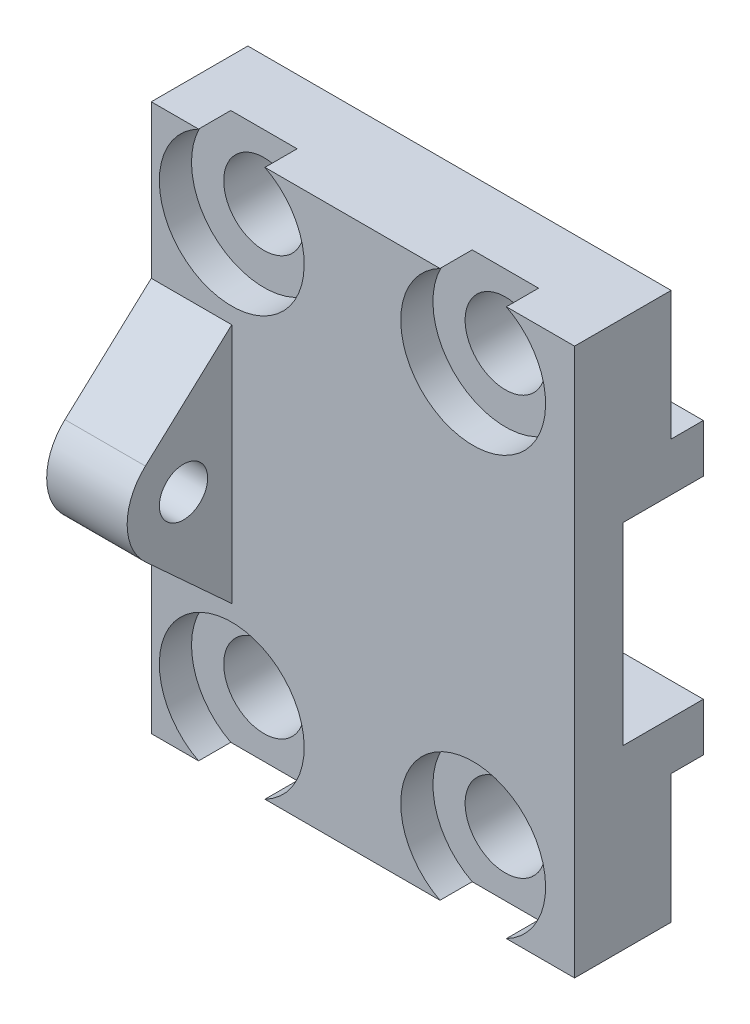
ISO-10303-21;
HEADER;
FILE_DESCRIPTION(('STEP AP214'),'2;1');
FILE_NAME('part.step','',(''),(''),'','','');
FILE_SCHEMA(('AUTOMOTIVE_DESIGN { 1 0 10303 214 1 1 1 1 }'));
ENDSEC;
DATA;
#1=APPLICATION_CONTEXT('core data for automotive mechanical design processes');
#2=APPLICATION_PROTOCOL_DEFINITION('international standard','automotive_design',2000,#1);
#3=PRODUCT_CONTEXT('',#1,'mechanical');
#4=PRODUCT('Part','Part','',(#3));
#5=PRODUCT_RELATED_PRODUCT_CATEGORY('part','',(#4));
#6=PRODUCT_DEFINITION_FORMATION('','',#4);
#7=PRODUCT_DEFINITION_CONTEXT('part definition',#1,'design');
#8=PRODUCT_DEFINITION('design','',#6,#7);
#9=PRODUCT_DEFINITION_SHAPE('','',#8);
#10=(LENGTH_UNIT() NAMED_UNIT(*) SI_UNIT(.MILLI.,.METRE.));
#11=(NAMED_UNIT(*) PLANE_ANGLE_UNIT() SI_UNIT($,.RADIAN.));
#12=(NAMED_UNIT(*) SI_UNIT($,.STERADIAN.) SOLID_ANGLE_UNIT());
#13=UNCERTAINTY_MEASURE_WITH_UNIT(LENGTH_MEASURE(1.E-05),#10,'distance_accuracy_value','');
#14=(GEOMETRIC_REPRESENTATION_CONTEXT(3) GLOBAL_UNCERTAINTY_ASSIGNED_CONTEXT((#13)) GLOBAL_UNIT_ASSIGNED_CONTEXT((#10,
#11,#12)) REPRESENTATION_CONTEXT('',''));
#15=CARTESIAN_POINT('',(0.,0.,0.));
#16=DIRECTION('',(0.,0.,1.));
#17=DIRECTION('',(1.,0.,0.));
#18=AXIS2_PLACEMENT_3D('',#15,#16,#17);
#19=CARTESIAN_POINT('',(-9.14999999999998,-8.05899712340822,7.39043415958187));
#20=DIRECTION('',(0.,0.737016546633587,-0.675874699917301));
#21=DIRECTION('',(0.,0.675874699917301,0.737016546633587));
#22=AXIS2_PLACEMENT_3D('',#19,#20,#21);
#23=PLANE('',#22);
#24=DIRECTION('',(0.,-0.675874699917301,-0.737016546633587));
#25=VECTOR('',#24,1.);
#26=CARTESIAN_POINT('',(-14.15,-8.05899712340822,7.39043415958187));
#27=LINE('',#26,#25);
#28=CARTESIAN_POINT('',(-14.15,-2.57955791321755,13.3655614497106));
#29=VERTEX_POINT('',#28);
#30=CARTESIAN_POINT('',(-14.15,-7.5,8.));
#31=VERTEX_POINT('',#30);
#32=EDGE_CURVE('E115',#29,#31,#27,.T.);
#33=ORIENTED_EDGE('',*,*,#32,.T.);
#34=DIRECTION('',(-1.,0.,0.));
#35=VECTOR('',#34,1.);
#36=CARTESIAN_POINT('',(-9.14999999999998,-7.5,8.));
#37=LINE('',#36,#35);
#38=CARTESIAN_POINT('',(-9.14999999999998,-7.5,8.));
#39=VERTEX_POINT('',#38);
#40=EDGE_CURVE('E12',#39,#31,#37,.T.);
#41=ORIENTED_EDGE('',*,*,#40,.F.);
#42=DIRECTION('',(0.,-0.675874699917301,-0.737016546633587));
#43=VECTOR('',#42,1.);
#44=CARTESIAN_POINT('',(-9.14999999999998,-8.05899712340822,7.39043415958187));
#45=LINE('',#44,#43);
#46=CARTESIAN_POINT('',(-9.14999999999998,-2.57955791321755,13.3655614497106));
#47=VERTEX_POINT('',#46);
#48=EDGE_CURVE('E105',#47,#39,#45,.T.);
#49=ORIENTED_EDGE('',*,*,#48,.F.);
#50=DIRECTION('',(-1.,0.,0.));
#51=VECTOR('',#50,1.);
#52=CARTESIAN_POINT('',(-9.14999999999998,-2.57955791321755,13.3655614497106));
#53=LINE('',#52,#51);
#54=EDGE_CURVE('E49',#47,#29,#53,.T.);
#55=ORIENTED_EDGE('',*,*,#54,.T.);
#56=EDGE_LOOP('',(#33,#41,#49,#55));
#57=FACE_BOUND('',#56,.T.);
#58=ADVANCED_FACE('F45',(#57),#23,.F.);
#59=CARTESIAN_POINT('',(-9.14999999999998,0.,8.));
#60=DIRECTION('',(0.,0.,1.));
#61=DIRECTION('',(1.,0.,0.));
#62=AXIS2_PLACEMENT_3D('',#59,#60,#61);
#63=PLANE('',#62);
#64=DIRECTION('',(0.,1.,0.));
#65=VECTOR('',#64,1.);
#66=CARTESIAN_POINT('',(-14.15,0.,8.));
#67=LINE('',#66,#65);
#68=CARTESIAN_POINT('',(-14.15,7.5,8.));
#69=VERTEX_POINT('',#68);
#70=EDGE_CURVE('E85',#31,#69,#67,.T.);
#71=ORIENTED_EDGE('',*,*,#70,.T.);
#72=DIRECTION('',(-1.,0.,0.));
#73=VECTOR('',#72,1.);
#74=CARTESIAN_POINT('',(-9.14999999999998,7.5,8.));
#75=LINE('',#74,#73);
#76=CARTESIAN_POINT('',(-9.14999999999998,7.5,8.));
#77=VERTEX_POINT('',#76);
#78=EDGE_CURVE('E55',#77,#69,#75,.T.);
#79=ORIENTED_EDGE('',*,*,#78,.F.);
#80=DIRECTION('',(0.,1.,0.));
#81=VECTOR('',#80,1.);
#82=CARTESIAN_POINT('',(-9.14999999999998,0.,8.));
#83=LINE('',#82,#81);
#84=EDGE_CURVE('E63',#39,#77,#83,.T.);
#85=ORIENTED_EDGE('',*,*,#84,.F.);
#86=ORIENTED_EDGE('',*,*,#40,.T.);
#87=EDGE_LOOP('',(#71,#79,#85,#86));
#88=FACE_BOUND('',#87,.T.);
#89=ADVANCED_FACE('F135',(#88),#63,.F.);
#90=CARTESIAN_POINT('',(-9.14999999999998,8.05899712340822,7.39043415958187));
#91=DIRECTION('',(0.,0.737016546633587,0.675874699917301));
#92=DIRECTION('',(0.,-0.675874699917301,0.737016546633587));
#93=AXIS2_PLACEMENT_3D('',#90,#91,#92);
#94=PLANE('',#93);
#95=DIRECTION('',(0.,0.675874699917301,-0.737016546633587));
#96=VECTOR('',#95,1.);
#97=CARTESIAN_POINT('',(-14.15,8.05899712340822,7.39043415958187));
#98=LINE('',#97,#96);
#99=CARTESIAN_POINT('',(-14.15,2.57955791321755,13.3655614497106));
#100=VERTEX_POINT('',#99);
#101=EDGE_CURVE('E97',#100,#69,#98,.T.);
#102=ORIENTED_EDGE('',*,*,#101,.F.);
#103=DIRECTION('',(-1.,0.,0.));
#104=VECTOR('',#103,1.);
#105=CARTESIAN_POINT('',(-9.14999999999998,2.57955791321755,13.3655614497106));
#106=LINE('',#105,#104);
#107=CARTESIAN_POINT('',(-9.14999999999998,2.57955791321755,13.3655614497106));
#108=VERTEX_POINT('',#107);
#109=EDGE_CURVE('E93',#108,#100,#106,.T.);
#110=ORIENTED_EDGE('',*,*,#109,.F.);
#111=DIRECTION('',(0.,0.675874699917301,-0.737016546633587));
#112=VECTOR('',#111,1.);
#113=CARTESIAN_POINT('',(-9.14999999999998,8.05899712340822,7.39043415958187));
#114=LINE('',#113,#112);
#115=EDGE_CURVE('E96',#108,#77,#114,.T.);
#116=ORIENTED_EDGE('',*,*,#115,.T.);
#117=ORIENTED_EDGE('',*,*,#78,.T.);
#118=EDGE_LOOP('',(#102,#110,#116,#117));
#119=FACE_BOUND('',#118,.T.);
#120=ADVANCED_FACE('F95',(#119),#94,.T.);
#121=CARTESIAN_POINT('',(-9.14999999999998,0.,11.));
#122=DIRECTION('',(-1.,0.,0.));
#123=DIRECTION('',(0.,0.,1.));
#124=AXIS2_PLACEMENT_3D('',#121,#122,#123);
#125=CYLINDRICAL_SURFACE('',#124,1.5);
#126=CARTESIAN_POINT('',(-9.14999999999998,0.,11.));
#127=DIRECTION('',(-1.,0.,0.));
#128=DIRECTION('',(0.,0.,1.));
#129=AXIS2_PLACEMENT_3D('',#126,#127,#128);
#130=CIRCLE('',#129,1.5);
#131=CARTESIAN_POINT('',(-9.14999999999998,0.,12.5));
#132=VERTEX_POINT('',#131);
#133=EDGE_CURVE('E107',#132,#132,#130,.T.);
#134=ORIENTED_EDGE('',*,*,#133,.F.);
#135=EDGE_LOOP('',(#134));
#136=FACE_BOUND('',#135,.T.);
#137=CARTESIAN_POINT('',(-14.15,0.,11.));
#138=DIRECTION('',(-1.,0.,0.));
#139=DIRECTION('',(0.,0.,1.));
#140=AXIS2_PLACEMENT_3D('',#137,#138,#139);
#141=CIRCLE('',#140,1.5);
#142=CARTESIAN_POINT('',(-14.15,0.,12.5));
#143=VERTEX_POINT('',#142);
#144=EDGE_CURVE('E112',#143,#143,#141,.T.);
#145=ORIENTED_EDGE('',*,*,#144,.T.);
#146=EDGE_LOOP('',(#145));
#147=FACE_BOUND('',#146,.T.);
#148=ADVANCED_FACE('F47',(#136,#147),#125,.F.);
#149=CARTESIAN_POINT('',(-9.14999999999998,0.,11.));
#150=DIRECTION('',(-1.,0.,0.));
#151=DIRECTION('',(0.,0.,1.));
#152=AXIS2_PLACEMENT_3D('',#149,#150,#151);
#153=CYLINDRICAL_SURFACE('',#152,3.5);
#154=CARTESIAN_POINT('',(-14.15,0.,11.));
#155=DIRECTION('',(-1.,0.,0.));
#156=DIRECTION('',(0.,0.,1.));
#157=AXIS2_PLACEMENT_3D('',#154,#155,#156);
#158=CIRCLE('',#157,3.5);
#159=EDGE_CURVE('E118',#29,#100,#158,.T.);
#160=ORIENTED_EDGE('',*,*,#159,.F.);
#161=ORIENTED_EDGE('',*,*,#54,.F.);
#162=CARTESIAN_POINT('',(-9.14999999999998,0.,11.));
#163=DIRECTION('',(-1.,0.,0.));
#164=DIRECTION('',(0.,0.,1.));
#165=AXIS2_PLACEMENT_3D('',#162,#163,#164);
#166=CIRCLE('',#165,3.5);
#167=EDGE_CURVE('E102',#47,#108,#166,.T.);
#168=ORIENTED_EDGE('',*,*,#167,.T.);
#169=ORIENTED_EDGE('',*,*,#109,.T.);
#170=EDGE_LOOP('',(#160,#161,#168,#169));
#171=FACE_BOUND('',#170,.T.);
#172=ADVANCED_FACE('F104',(#171),#153,.T.);
#173=CARTESIAN_POINT('',(-9.14999999999998,0.,0.));
#174=DIRECTION('',(-1.,0.,0.));
#175=DIRECTION('',(0.,0.,1.));
#176=AXIS2_PLACEMENT_3D('',#173,#174,#175);
#177=PLANE('',#176);
#178=ORIENTED_EDGE('',*,*,#133,.T.);
#179=EDGE_LOOP('',(#178));
#180=FACE_BOUND('',#179,.T.);
#181=ORIENTED_EDGE('',*,*,#48,.T.);
#182=ORIENTED_EDGE('',*,*,#84,.T.);
#183=ORIENTED_EDGE('',*,*,#115,.F.);
#184=ORIENTED_EDGE('',*,*,#167,.F.);
#185=EDGE_LOOP('',(#181,#182,#183,#184));
#186=FACE_BOUND('',#185,.T.);
#187=ADVANCED_FACE('F101',(#180,#186),#177,.F.);
#188=CARTESIAN_POINT('',(-14.15,0.,0.));
#189=DIRECTION('',(-1.,0.,0.));
#190=DIRECTION('',(0.,0.,1.));
#191=AXIS2_PLACEMENT_3D('',#188,#189,#190);
#192=PLANE('',#191);
#193=ORIENTED_EDGE('',*,*,#144,.F.);
#194=EDGE_LOOP('',(#193));
#195=FACE_BOUND('',#194,.T.);
#196=ORIENTED_EDGE('',*,*,#32,.F.);
#197=ORIENTED_EDGE('',*,*,#159,.T.);
#198=ORIENTED_EDGE('',*,*,#101,.T.);
#199=ORIENTED_EDGE('',*,*,#70,.F.);
#200=EDGE_LOOP('',(#196,#197,#198,#199));
#201=FACE_BOUND('',#200,.T.);
#202=ADVANCED_FACE('F130',(#195,#201),#192,.T.);
#203=CLOSED_SHELL('',(#58,#89,#120,#148,#172,#187,#202));
#204=MANIFOLD_SOLID_BREP('B2',#203);
#205=CARTESIAN_POINT('',(-9.15000000000001,13.,-25.4898162962214));
#206=DIRECTION('',(0.,0.,1.));
#207=DIRECTION('',(1.,0.,0.));
#208=AXIS2_PLACEMENT_3D('',#205,#206,#207);
#209=CYLINDRICAL_SURFACE('',#208,2.5);
#210=CARTESIAN_POINT('',(-9.15000000000001,13.,1.99999999999999));
#211=DIRECTION('',(0.,0.,-1.));
#212=DIRECTION('',(-0.984807753012207,0.173648177666935,0.));
#213=AXIS2_PLACEMENT_3D('',#210,#211,#212);
#214=CIRCLE('',#213,2.5);
#215=CARTESIAN_POINT('',(-11.6120193825305,13.4341204441674,1.99999999999999));
#216=VERTEX_POINT('',#215);
#217=EDGE_CURVE('E394',#216,#216,#214,.T.);
#218=ORIENTED_EDGE('',*,*,#217,.T.);
#219=EDGE_LOOP('',(#218));
#220=FACE_BOUND('',#219,.T.);
#221=CARTESIAN_POINT('',(-9.15000000000001,13.,6.));
#222=DIRECTION('',(0.,0.,1.));
#223=DIRECTION('',(1.,0.,0.));
#224=AXIS2_PLACEMENT_3D('',#221,#222,#223);
#225=CIRCLE('',#224,2.5);
#226=CARTESIAN_POINT('',(-6.65,13.,6.));
#227=VERTEX_POINT('',#226);
#228=EDGE_CURVE('E585',#227,#227,#225,.F.);
#229=ORIENTED_EDGE('',*,*,#228,.F.);
#230=EDGE_LOOP('',(#229));
#231=FACE_BOUND('',#230,.T.);
#232=ADVANCED_FACE('F211',(#220,#231),#209,.F.);
#233=CARTESIAN_POINT('',(-9.14999999999998,-13.,-25.4898162962214));
#234=DIRECTION('',(0.,0.,1.));
#235=DIRECTION('',(1.,0.,0.));
#236=AXIS2_PLACEMENT_3D('',#233,#234,#235);
#237=CYLINDRICAL_SURFACE('',#236,2.5);
#238=CARTESIAN_POINT('',(-9.14999999999998,-13.,2.00000000000003));
#239=DIRECTION('',(0.,0.,-1.));
#240=DIRECTION('',(0.,1.,0.));
#241=AXIS2_PLACEMENT_3D('',#238,#239,#240);
#242=CIRCLE('',#241,2.5);
#243=CARTESIAN_POINT('',(-9.14999999999998,-10.5,2.00000000000002));
#244=VERTEX_POINT('',#243);
#245=EDGE_CURVE('E504',#244,#244,#242,.F.);
#246=ORIENTED_EDGE('',*,*,#245,.F.);
#247=EDGE_LOOP('',(#246));
#248=FACE_BOUND('',#247,.T.);
#249=CARTESIAN_POINT('',(-9.14999999999998,-13.,6.));
#250=DIRECTION('',(0.,0.,1.));
#251=DIRECTION('',(1.,0.,0.));
#252=AXIS2_PLACEMENT_3D('',#249,#250,#251);
#253=CIRCLE('',#252,2.5);
#254=CARTESIAN_POINT('',(-6.64999999999998,-13.,6.));
#255=VERTEX_POINT('',#254);
#256=EDGE_CURVE('E579',#255,#255,#253,.F.);
#257=ORIENTED_EDGE('',*,*,#256,.F.);
#258=EDGE_LOOP('',(#257));
#259=FACE_BOUND('',#258,.T.);
#260=ADVANCED_FACE('F556',(#248,#259),#237,.F.);
#261=CARTESIAN_POINT('',(5.85000000000002,-13.,-25.4898162962214));
#262=DIRECTION('',(0.,0.,1.));
#263=DIRECTION('',(1.,0.,0.));
#264=AXIS2_PLACEMENT_3D('',#261,#262,#263);
#265=CYLINDRICAL_SURFACE('',#264,2.5);
#266=CARTESIAN_POINT('',(5.85000000000002,-13.,2.00000000000004));
#267=DIRECTION('',(0.,0.,-1.));
#268=DIRECTION('',(0.,1.,0.));
#269=AXIS2_PLACEMENT_3D('',#266,#267,#268);
#270=CIRCLE('',#269,2.5);
#271=CARTESIAN_POINT('',(5.85000000000002,-10.5,2.00000000000004));
#272=VERTEX_POINT('',#271);
#273=EDGE_CURVE('E521',#272,#272,#270,.F.);
#274=ORIENTED_EDGE('',*,*,#273,.F.);
#275=EDGE_LOOP('',(#274));
#276=FACE_BOUND('',#275,.T.);
#277=CARTESIAN_POINT('',(5.85000000000002,-13.,6.));
#278=DIRECTION('',(0.,0.,1.));
#279=DIRECTION('',(1.,0.,0.));
#280=AXIS2_PLACEMENT_3D('',#277,#278,#279);
#281=CIRCLE('',#280,2.5);
#282=CARTESIAN_POINT('',(8.35000000000002,-13.,6.));
#283=VERTEX_POINT('',#282);
#284=EDGE_CURVE('E560',#283,#283,#281,.F.);
#285=ORIENTED_EDGE('',*,*,#284,.F.);
#286=EDGE_LOOP('',(#285));
#287=FACE_BOUND('',#286,.T.);
#288=ADVANCED_FACE('F552',(#276,#287),#265,.F.);
#289=CARTESIAN_POINT('',(5.85,13.,-25.4898162962214));
#290=DIRECTION('',(0.,0.,1.));
#291=DIRECTION('',(1.,0.,0.));
#292=AXIS2_PLACEMENT_3D('',#289,#290,#291);
#293=CYLINDRICAL_SURFACE('',#292,2.49999999999999);
#294=CARTESIAN_POINT('',(5.85,13.,2.00000000000001));
#295=DIRECTION('',(0.,0.,-1.));
#296=DIRECTION('',(-0.984807753012207,0.173648177666935,0.));
#297=AXIS2_PLACEMENT_3D('',#294,#295,#296);
#298=CIRCLE('',#297,2.49999999999999);
#299=CARTESIAN_POINT('',(3.38798061746949,13.4341204441674,2.00000000000001));
#300=VERTEX_POINT('',#299);
#301=EDGE_CURVE('E402',#300,#300,#298,.T.);
#302=ORIENTED_EDGE('',*,*,#301,.T.);
#303=EDGE_LOOP('',(#302));
#304=FACE_BOUND('',#303,.T.);
#305=CARTESIAN_POINT('',(5.85,13.,6.));
#306=DIRECTION('',(0.,0.,1.));
#307=DIRECTION('',(1.,0.,0.));
#308=AXIS2_PLACEMENT_3D('',#305,#306,#307);
#309=CIRCLE('',#308,2.49999999999999);
#310=CARTESIAN_POINT('',(8.34999999999999,13.,6.));
#311=VERTEX_POINT('',#310);
#312=EDGE_CURVE('E601',#311,#311,#309,.F.);
#313=ORIENTED_EDGE('',*,*,#312,.F.);
#314=EDGE_LOOP('',(#313));
#315=FACE_BOUND('',#314,.T.);
#316=ADVANCED_FACE('F555',(#304,#315),#293,.F.);
#317=CARTESIAN_POINT('',(0.,9.,5.));
#318=DIRECTION('',(0.,1.,0.));
#319=DIRECTION('',(0.,0.,1.));
#320=AXIS2_PLACEMENT_3D('',#317,#318,#319);
#321=PLANE('',#320);
#322=DIRECTION('',(0.,0.,-1.));
#323=VECTOR('',#322,1.);
#324=CARTESIAN_POINT('',(-14.15,9.,0.));
#325=LINE('',#324,#323);
#326=CARTESIAN_POINT('',(-14.15,9.,1.99999999999999));
#327=VERTEX_POINT('',#326);
#328=CARTESIAN_POINT('',(-14.15,9.,0.));
#329=VERTEX_POINT('',#328);
#330=EDGE_CURVE('E415',#327,#329,#325,.T.);
#331=ORIENTED_EDGE('',*,*,#330,.F.);
#332=DIRECTION('',(1.,0.,0.));
#333=VECTOR('',#332,1.);
#334=CARTESIAN_POINT('',(12.15,9.,2.00000000000002));
#335=LINE('',#334,#333);
#336=CARTESIAN_POINT('',(12.15,9.,2.00000000000001));
#337=VERTEX_POINT('',#336);
#338=EDGE_CURVE('E406',#327,#337,#335,.T.);
#339=ORIENTED_EDGE('',*,*,#338,.T.);
#340=DIRECTION('',(0.,0.,-1.));
#341=VECTOR('',#340,1.);
#342=CARTESIAN_POINT('',(12.15,9.,5.));
#343=LINE('',#342,#341);
#344=CARTESIAN_POINT('',(12.15,9.,0.));
#345=VERTEX_POINT('',#344);
#346=EDGE_CURVE('E426',#337,#345,#343,.T.);
#347=ORIENTED_EDGE('',*,*,#346,.T.);
#348=DIRECTION('',(1.,0.,0.));
#349=VECTOR('',#348,1.);
#350=CARTESIAN_POINT('',(0.,9.,0.));
#351=LINE('',#350,#349);
#352=EDGE_CURVE('E454',#329,#345,#351,.T.);
#353=ORIENTED_EDGE('',*,*,#352,.F.);
#354=EDGE_LOOP('',(#331,#339,#347,#353));
#355=FACE_BOUND('',#354,.T.);
#356=ADVANCED_FACE('F689',(#355),#321,.T.);
#357=CARTESIAN_POINT('',(12.15,0.,5.));
#358=DIRECTION('',(1.,0.,0.));
#359=DIRECTION('',(0.,0.,-1.));
#360=AXIS2_PLACEMENT_3D('',#357,#358,#359);
#361=PLANE('',#360);
#362=DIRECTION('',(0.,-1.,0.));
#363=VECTOR('',#362,1.);
#364=CARTESIAN_POINT('',(12.15,0.,0.));
#365=LINE('',#364,#363);
#366=CARTESIAN_POINT('',(12.15,6.,0.));
#367=VERTEX_POINT('',#366);
#368=EDGE_CURVE('E452',#345,#367,#365,.T.);
#369=ORIENTED_EDGE('',*,*,#368,.F.);
#370=ORIENTED_EDGE('',*,*,#346,.F.);
#371=DIRECTION('',(0.,1.,0.));
#372=VECTOR('',#371,1.);
#373=CARTESIAN_POINT('',(12.15,9.00000000000003,2.00000000000002));
#374=LINE('',#373,#372);
#375=CARTESIAN_POINT('',(12.15,17.,2.00000000000001));
#376=VERTEX_POINT('',#375);
#377=EDGE_CURVE('E407',#337,#376,#374,.T.);
#378=ORIENTED_EDGE('',*,*,#377,.T.);
#379=DIRECTION('',(0.,0.,1.));
#380=VECTOR('',#379,1.);
#381=CARTESIAN_POINT('',(12.15,17.,-25.4898162962214));
#382=LINE('',#381,#380);
#383=CARTESIAN_POINT('',(12.15,17.,8.));
#384=VERTEX_POINT('',#383);
#385=EDGE_CURVE('E403',#376,#384,#382,.T.);
#386=ORIENTED_EDGE('',*,*,#385,.T.);
#387=DIRECTION('',(0.,1.,0.));
#388=VECTOR('',#387,1.);
#389=CARTESIAN_POINT('',(12.15,9.,8.));
#390=LINE('',#389,#388);
#391=CARTESIAN_POINT('',(12.15,-17.,8.));
#392=VERTEX_POINT('',#391);
#393=EDGE_CURVE('E480',#392,#384,#390,.T.);
#394=ORIENTED_EDGE('',*,*,#393,.F.);
#395=DIRECTION('',(0.,0.,1.));
#396=VECTOR('',#395,1.);
#397=CARTESIAN_POINT('',(12.15,-17.,-25.4898162962214));
#398=LINE('',#397,#396);
#399=CARTESIAN_POINT('',(12.15,-17.,2.00000000000005));
#400=VERTEX_POINT('',#399);
#401=EDGE_CURVE('E510',#400,#392,#398,.T.);
#402=ORIENTED_EDGE('',*,*,#401,.F.);
#403=DIRECTION('',(0.,1.,0.));
#404=VECTOR('',#403,1.);
#405=CARTESIAN_POINT('',(12.15,-8.99999999999997,2.00000000000004));
#406=LINE('',#405,#404);
#407=CARTESIAN_POINT('',(12.15,-9.,2.00000000000004));
#408=VERTEX_POINT('',#407);
#409=EDGE_CURVE('E518',#400,#408,#406,.T.);
#410=ORIENTED_EDGE('',*,*,#409,.T.);
#411=DIRECTION('',(0.,0.,-1.));
#412=VECTOR('',#411,1.);
#413=CARTESIAN_POINT('',(12.15,-9.,8.));
#414=LINE('',#413,#412);
#415=CARTESIAN_POINT('',(12.15,-9.,0.));
#416=VERTEX_POINT('',#415);
#417=EDGE_CURVE('E455',#408,#416,#414,.T.);
#418=ORIENTED_EDGE('',*,*,#417,.T.);
#419=DIRECTION('',(0.,-1.,0.));
#420=VECTOR('',#419,1.);
#421=CARTESIAN_POINT('',(12.15,0.,0.));
#422=LINE('',#421,#420);
#423=CARTESIAN_POINT('',(12.15,-6.,0.));
#424=VERTEX_POINT('',#423);
#425=EDGE_CURVE('E501',#424,#416,#422,.T.);
#426=ORIENTED_EDGE('',*,*,#425,.F.);
#427=DIRECTION('',(0.,0.,-1.));
#428=VECTOR('',#427,1.);
#429=CARTESIAN_POINT('',(12.15,-6.,5.));
#430=LINE('',#429,#428);
#431=CARTESIAN_POINT('',(12.15,-6.,5.));
#432=VERTEX_POINT('',#431);
#433=EDGE_CURVE('E476',#432,#424,#430,.T.);
#434=ORIENTED_EDGE('',*,*,#433,.F.);
#435=DIRECTION('',(0.,1.,0.));
#436=VECTOR('',#435,1.);
#437=CARTESIAN_POINT('',(12.15,9.,5.));
#438=LINE('',#437,#436);
#439=CARTESIAN_POINT('',(12.15,6.,5.));
#440=VERTEX_POINT('',#439);
#441=EDGE_CURVE('E474',#432,#440,#438,.T.);
#442=ORIENTED_EDGE('',*,*,#441,.T.);
#443=DIRECTION('',(0.,0.,-1.));
#444=VECTOR('',#443,1.);
#445=CARTESIAN_POINT('',(12.15,6.,5.));
#446=LINE('',#445,#444);
#447=EDGE_CURVE('E437',#440,#367,#446,.T.);
#448=ORIENTED_EDGE('',*,*,#447,.T.);
#449=EDGE_LOOP('',(#369,#370,#378,#386,#394,#402,#410,#418,#426,#434,#442,#448));
#450=FACE_BOUND('',#449,.T.);
#451=ADVANCED_FACE('F213',(#450),#361,.T.);
#452=CARTESIAN_POINT('',(0.,6.,5.));
#453=DIRECTION('',(0.,1.,0.));
#454=DIRECTION('',(0.,0.,1.));
#455=AXIS2_PLACEMENT_3D('',#452,#453,#454);
#456=PLANE('',#455);
#457=DIRECTION('',(1.,0.,0.));
#458=VECTOR('',#457,1.);
#459=CARTESIAN_POINT('',(0.,6.,0.));
#460=LINE('',#459,#458);
#461=CARTESIAN_POINT('',(-14.15,6.,0.));
#462=VERTEX_POINT('',#461);
#463=EDGE_CURVE('E435',#462,#367,#460,.T.);
#464=ORIENTED_EDGE('',*,*,#463,.T.);
#465=ORIENTED_EDGE('',*,*,#447,.F.);
#466=DIRECTION('',(1.,0.,0.));
#467=VECTOR('',#466,1.);
#468=CARTESIAN_POINT('',(0.,6.,5.));
#469=LINE('',#468,#467);
#470=CARTESIAN_POINT('',(-12.15,6.,5.));
#471=VERTEX_POINT('',#470);
#472=EDGE_CURVE('E439',#471,#440,#469,.T.);
#473=ORIENTED_EDGE('',*,*,#472,.F.);
#474=DIRECTION('',(0.,0.,-1.));
#475=VECTOR('',#474,1.);
#476=CARTESIAN_POINT('',(-12.15,6.,5.));
#477=LINE('',#476,#475);
#478=CARTESIAN_POINT('',(-12.15,6.,3.));
#479=VERTEX_POINT('',#478);
#480=EDGE_CURVE('E430',#471,#479,#477,.T.);
#481=ORIENTED_EDGE('',*,*,#480,.T.);
#482=DIRECTION('',(1.,0.,0.));
#483=VECTOR('',#482,1.);
#484=CARTESIAN_POINT('',(-14.15,6.,3.));
#485=LINE('',#484,#483);
#486=CARTESIAN_POINT('',(-14.15,6.,3.));
#487=VERTEX_POINT('',#486);
#488=EDGE_CURVE('E528',#487,#479,#485,.T.);
#489=ORIENTED_EDGE('',*,*,#488,.F.);
#490=DIRECTION('',(0.,0.,1.));
#491=VECTOR('',#490,1.);
#492=CARTESIAN_POINT('',(-14.15,6.,3.));
#493=LINE('',#492,#491);
#494=EDGE_CURVE('E466',#462,#487,#493,.T.);
#495=ORIENTED_EDGE('',*,*,#494,.F.);
#496=EDGE_LOOP('',(#464,#465,#473,#481,#489,#495));
#497=FACE_BOUND('',#496,.T.);
#498=ADVANCED_FACE('F464',(#497),#456,.F.);
#499=CARTESIAN_POINT('',(0.,0.,0.));
#500=DIRECTION('',(0.,0.,1.));
#501=DIRECTION('',(1.,0.,0.));
#502=AXIS2_PLACEMENT_3D('',#499,#500,#501);
#503=PLANE('',#502);
#504=ORIENTED_EDGE('',*,*,#368,.T.);
#505=ORIENTED_EDGE('',*,*,#463,.F.);
#506=DIRECTION('',(0.,-1.,0.));
#507=VECTOR('',#506,1.);
#508=CARTESIAN_POINT('',(-14.15,6.,0.));
#509=LINE('',#508,#507);
#510=EDGE_CURVE('E419',#329,#462,#509,.T.);
#511=ORIENTED_EDGE('',*,*,#510,.F.);
#512=ORIENTED_EDGE('',*,*,#352,.T.);
#513=EDGE_LOOP('',(#504,#505,#511,#512));
#514=FACE_BOUND('',#513,.T.);
#515=ADVANCED_FACE('F469',(#514),#503,.F.);
#516=CARTESIAN_POINT('',(0.,0.,5.));
#517=DIRECTION('',(0.,0.,1.));
#518=DIRECTION('',(1.,0.,0.));
#519=AXIS2_PLACEMENT_3D('',#516,#517,#518);
#520=PLANE('',#519);
#521=ORIENTED_EDGE('',*,*,#441,.F.);
#522=DIRECTION('',(1.,0.,0.));
#523=VECTOR('',#522,1.);
#524=CARTESIAN_POINT('',(0.,-6.,5.));
#525=LINE('',#524,#523);
#526=CARTESIAN_POINT('',(-12.15,-6.,5.));
#527=VERTEX_POINT('',#526);
#528=EDGE_CURVE('E494',#527,#432,#525,.T.);
#529=ORIENTED_EDGE('',*,*,#528,.F.);
#530=DIRECTION('',(0.,1.,0.));
#531=VECTOR('',#530,1.);
#532=CARTESIAN_POINT('',(-12.15,0.,5.));
#533=LINE('',#532,#531);
#534=CARTESIAN_POINT('',(-12.15,-4.,5.));
#535=VERTEX_POINT('',#534);
#536=EDGE_CURVE('E525',#527,#535,#533,.T.);
#537=ORIENTED_EDGE('',*,*,#536,.T.);
#538=DIRECTION('',(1.,0.,0.));
#539=VECTOR('',#538,1.);
#540=CARTESIAN_POINT('',(-14.15,-4.,5.));
#541=LINE('',#540,#539);
#542=CARTESIAN_POINT('',(-14.15,-4.,5.));
#543=VERTEX_POINT('',#542);
#544=EDGE_CURVE('E969',#543,#535,#541,.T.);
#545=ORIENTED_EDGE('',*,*,#544,.F.);
#546=DIRECTION('',(0.,-1.,0.));
#547=VECTOR('',#546,1.);
#548=CARTESIAN_POINT('',(-14.15,-4.,5.));
#549=LINE('',#548,#547);
#550=CARTESIAN_POINT('',(-14.15,4.,5.));
#551=VERTEX_POINT('',#550);
#552=EDGE_CURVE('E976',#551,#543,#549,.T.);
#553=ORIENTED_EDGE('',*,*,#552,.F.);
#554=DIRECTION('',(1.,0.,0.));
#555=VECTOR('',#554,1.);
#556=CARTESIAN_POINT('',(-14.15,4.,5.));
#557=LINE('',#556,#555);
#558=CARTESIAN_POINT('',(-12.15,4.,5.));
#559=VERTEX_POINT('',#558);
#560=EDGE_CURVE('E534',#551,#559,#557,.T.);
#561=ORIENTED_EDGE('',*,*,#560,.T.);
#562=DIRECTION('',(0.,-1.,0.));
#563=VECTOR('',#562,1.);
#564=CARTESIAN_POINT('',(-12.15,9.,5.));
#565=LINE('',#564,#563);
#566=EDGE_CURVE('E449',#471,#559,#565,.T.);
#567=ORIENTED_EDGE('',*,*,#566,.F.);
#568=ORIENTED_EDGE('',*,*,#472,.T.);
#569=EDGE_LOOP('',(#521,#529,#537,#545,#553,#561,#567,#568));
#570=FACE_BOUND('',#569,.T.);
#571=ADVANCED_FACE('F680',(#570),#520,.F.);
#572=CARTESIAN_POINT('',(-12.15,-9.,8.));
#573=DIRECTION('',(0.,1.,0.));
#574=DIRECTION('',(0.,0.,1.));
#575=AXIS2_PLACEMENT_3D('',#572,#573,#574);
#576=PLANE('',#575);
#577=ORIENTED_EDGE('',*,*,#417,.F.);
#578=DIRECTION('',(-1.,0.,0.));
#579=VECTOR('',#578,1.);
#580=CARTESIAN_POINT('',(12.15,-9.,2.00000000000004));
#581=LINE('',#580,#579);
#582=CARTESIAN_POINT('',(-14.15,-9.,2.00000000000001));
#583=VERTEX_POINT('',#582);
#584=EDGE_CURVE('E508',#408,#583,#581,.T.);
#585=ORIENTED_EDGE('',*,*,#584,.T.);
#586=DIRECTION('',(0.,0.,1.));
#587=VECTOR('',#586,1.);
#588=CARTESIAN_POINT('',(-14.15,-9.,8.));
#589=LINE('',#588,#587);
#590=CARTESIAN_POINT('',(-14.15,-9.,0.));
#591=VERTEX_POINT('',#590);
#592=EDGE_CURVE('E412',#591,#583,#589,.T.);
#593=ORIENTED_EDGE('',*,*,#592,.F.);
#594=DIRECTION('',(1.,0.,0.));
#595=VECTOR('',#594,1.);
#596=CARTESIAN_POINT('',(0.,-9.,0.));
#597=LINE('',#596,#595);
#598=EDGE_CURVE('E495',#591,#416,#597,.T.);
#599=ORIENTED_EDGE('',*,*,#598,.T.);
#600=EDGE_LOOP('',(#577,#585,#593,#599));
#601=FACE_BOUND('',#600,.T.);
#602=ADVANCED_FACE('F679',(#601),#576,.F.);
#603=CARTESIAN_POINT('',(0.,0.,8.));
#604=DIRECTION('',(0.,0.,1.));
#605=DIRECTION('',(1.,0.,0.));
#606=AXIS2_PLACEMENT_3D('',#603,#604,#605);
#607=PLANE('',#606);
#608=CARTESIAN_POINT('',(-9.15000000000001,13.,8.));
#609=DIRECTION('',(0.,0.,1.));
#610=DIRECTION('',(1.,0.,0.));
#611=AXIS2_PLACEMENT_3D('',#608,#609,#610);
#612=CIRCLE('',#611,4.5);
#613=CARTESIAN_POINT('',(-11.2115528128089,17.,8.));
#614=VERTEX_POINT('',#613);
#615=CARTESIAN_POINT('',(-7.08844718719113,17.,8.));
#616=VERTEX_POINT('',#615);
#617=EDGE_CURVE('E370',#614,#616,#612,.T.);
#618=ORIENTED_EDGE('',*,*,#617,.F.);
#619=DIRECTION('',(-1.,0.,0.));
#620=VECTOR('',#619,1.);
#621=CARTESIAN_POINT('',(12.15,17.,8.));
#622=LINE('',#621,#620);
#623=CARTESIAN_POINT('',(-14.15,17.,8.));
#624=VERTEX_POINT('',#623);
#625=EDGE_CURVE('E391',#614,#624,#622,.T.);
#626=ORIENTED_EDGE('',*,*,#625,.T.);
#627=DIRECTION('',(0.,-1.,0.));
#628=VECTOR('',#627,1.);
#629=CARTESIAN_POINT('',(-14.15,-9.,8.));
#630=LINE('',#629,#628);
#631=CARTESIAN_POINT('',(-14.15,-17.,8.));
#632=VERTEX_POINT('',#631);
#633=EDGE_CURVE('E523',#624,#632,#630,.T.);
#634=ORIENTED_EDGE('',*,*,#633,.T.);
#635=DIRECTION('',(1.,0.,0.));
#636=VECTOR('',#635,1.);
#637=CARTESIAN_POINT('',(12.15,-17.,8.));
#638=LINE('',#637,#636);
#639=CARTESIAN_POINT('',(-11.2115528128088,-17.,8.));
#640=VERTEX_POINT('',#639);
#641=EDGE_CURVE('E538',#632,#640,#638,.T.);
#642=ORIENTED_EDGE('',*,*,#641,.T.);
#643=CARTESIAN_POINT('',(-9.14999999999998,-13.,8.));
#644=DIRECTION('',(0.,0.,1.));
#645=DIRECTION('',(1.,0.,0.));
#646=AXIS2_PLACEMENT_3D('',#643,#644,#645);
#647=CIRCLE('',#646,4.5);
#648=CARTESIAN_POINT('',(-7.08844718719117,-17.,8.));
#649=VERTEX_POINT('',#648);
#650=EDGE_CURVE('E589',#649,#640,#647,.T.);
#651=ORIENTED_EDGE('',*,*,#650,.F.);
#652=CARTESIAN_POINT('',(3.78844718719123,-17.,8.));
#653=VERTEX_POINT('',#652);
#654=EDGE_CURVE('E541',#649,#653,#638,.T.);
#655=ORIENTED_EDGE('',*,*,#654,.T.);
#656=CARTESIAN_POINT('',(5.85000000000002,-13.,8.));
#657=DIRECTION('',(0.,0.,1.));
#658=DIRECTION('',(1.,0.,0.));
#659=AXIS2_PLACEMENT_3D('',#656,#657,#658);
#660=CIRCLE('',#659,4.5);
#661=CARTESIAN_POINT('',(7.91155281280881,-17.,8.));
#662=VERTEX_POINT('',#661);
#663=EDGE_CURVE('E567',#662,#653,#660,.T.);
#664=ORIENTED_EDGE('',*,*,#663,.F.);
#665=EDGE_CURVE('E542',#662,#392,#638,.T.);
#666=ORIENTED_EDGE('',*,*,#665,.T.);
#667=ORIENTED_EDGE('',*,*,#393,.T.);
#668=CARTESIAN_POINT('',(7.91155281280891,17.,8.));
#669=VERTEX_POINT('',#668);
#670=EDGE_CURVE('E390',#384,#669,#622,.T.);
#671=ORIENTED_EDGE('',*,*,#670,.T.);
#672=CARTESIAN_POINT('',(5.85,13.,8.));
#673=DIRECTION('',(0.,0.,1.));
#674=DIRECTION('',(1.,0.,0.));
#675=AXIS2_PLACEMENT_3D('',#672,#673,#674);
#676=CIRCLE('',#675,4.5);
#677=CARTESIAN_POINT('',(3.78844718719108,17.,8.));
#678=VERTEX_POINT('',#677);
#679=EDGE_CURVE('E389',#678,#669,#676,.T.);
#680=ORIENTED_EDGE('',*,*,#679,.F.);
#681=EDGE_CURVE('E383',#678,#616,#622,.T.);
#682=ORIENTED_EDGE('',*,*,#681,.T.);
#683=EDGE_LOOP('',(#618,#626,#634,#642,#651,#655,#664,#666,#667,#671,#680,#682));
#684=FACE_BOUND('',#683,.T.);
#685=ADVANCED_FACE('F387',(#684),#607,.T.);
#686=CARTESIAN_POINT('',(0.,-6.,5.));
#687=DIRECTION('',(0.,1.,0.));
#688=DIRECTION('',(0.,0.,1.));
#689=AXIS2_PLACEMENT_3D('',#686,#687,#688);
#690=PLANE('',#689);
#691=DIRECTION('',(1.,0.,0.));
#692=VECTOR('',#691,1.);
#693=CARTESIAN_POINT('',(0.,-6.,0.));
#694=LINE('',#693,#692);
#695=CARTESIAN_POINT('',(-14.15,-6.,0.));
#696=VERTEX_POINT('',#695);
#697=EDGE_CURVE('E498',#696,#424,#694,.T.);
#698=ORIENTED_EDGE('',*,*,#697,.F.);
#699=DIRECTION('',(0.,0.,-1.));
#700=VECTOR('',#699,1.);
#701=CARTESIAN_POINT('',(-14.15,-6.,0.));
#702=LINE('',#701,#700);
#703=CARTESIAN_POINT('',(-14.15,-6.,3.));
#704=VERTEX_POINT('',#703);
#705=EDGE_CURVE('E985',#704,#696,#702,.T.);
#706=ORIENTED_EDGE('',*,*,#705,.F.);
#707=DIRECTION('',(1.,0.,0.));
#708=VECTOR('',#707,1.);
#709=CARTESIAN_POINT('',(-14.15,-6.,3.));
#710=LINE('',#709,#708);
#711=CARTESIAN_POINT('',(-12.15,-6.,3.));
#712=VERTEX_POINT('',#711);
#713=EDGE_CURVE('E967',#704,#712,#710,.T.);
#714=ORIENTED_EDGE('',*,*,#713,.T.);
#715=DIRECTION('',(0.,0.,-1.));
#716=VECTOR('',#715,1.);
#717=CARTESIAN_POINT('',(-12.15,-6.,5.));
#718=LINE('',#717,#716);
#719=EDGE_CURVE('E492',#527,#712,#718,.T.);
#720=ORIENTED_EDGE('',*,*,#719,.F.);
#721=ORIENTED_EDGE('',*,*,#528,.T.);
#722=ORIENTED_EDGE('',*,*,#433,.T.);
#723=EDGE_LOOP('',(#698,#706,#714,#720,#721,#722));
#724=FACE_BOUND('',#723,.T.);
#725=ADVANCED_FACE('F672',(#724),#690,.T.);
#726=CARTESIAN_POINT('',(0.,0.,0.));
#727=DIRECTION('',(0.,0.,1.));
#728=DIRECTION('',(1.,0.,0.));
#729=AXIS2_PLACEMENT_3D('',#726,#727,#728);
#730=PLANE('',#729);
#731=ORIENTED_EDGE('',*,*,#425,.T.);
#732=ORIENTED_EDGE('',*,*,#598,.F.);
#733=DIRECTION('',(0.,-1.,0.));
#734=VECTOR('',#733,1.);
#735=CARTESIAN_POINT('',(-14.15,-9.,0.));
#736=LINE('',#735,#734);
#737=EDGE_CURVE('E970',#696,#591,#736,.T.);
#738=ORIENTED_EDGE('',*,*,#737,.F.);
#739=ORIENTED_EDGE('',*,*,#697,.T.);
#740=EDGE_LOOP('',(#731,#732,#738,#739));
#741=FACE_BOUND('',#740,.T.);
#742=ADVANCED_FACE('F664',(#741),#730,.F.);
#743=CARTESIAN_POINT('',(12.15,-17.,-25.4898162962214));
#744=DIRECTION('',(0.,-1.,0.));
#745=DIRECTION('',(0.,0.,-1.));
#746=AXIS2_PLACEMENT_3D('',#743,#744,#745);
#747=PLANE('',#746);
#748=DIRECTION('',(0.,0.,1.));
#749=VECTOR('',#748,1.);
#750=CARTESIAN_POINT('',(-7.08844718719117,-17.,6.));
#751=LINE('',#750,#749);
#752=CARTESIAN_POINT('',(-7.08844718719117,-17.,6.));
#753=VERTEX_POINT('',#752);
#754=EDGE_CURVE('E385',#753,#649,#751,.T.);
#755=ORIENTED_EDGE('',*,*,#754,.F.);
#756=DIRECTION('',(-1.,0.,0.));
#757=VECTOR('',#756,1.);
#758=CARTESIAN_POINT('',(12.15,-17.,6.));
#759=LINE('',#758,#757);
#760=CARTESIAN_POINT('',(-11.2115528128088,-17.,6.));
#761=VERTEX_POINT('',#760);
#762=EDGE_CURVE('E582',#753,#761,#759,.T.);
#763=ORIENTED_EDGE('',*,*,#762,.T.);
#764=DIRECTION('',(0.,0.,1.));
#765=VECTOR('',#764,1.);
#766=CARTESIAN_POINT('',(-11.2115528128088,-17.,6.));
#767=LINE('',#766,#765);
#768=EDGE_CURVE('E578',#640,#761,#767,.F.);
#769=ORIENTED_EDGE('',*,*,#768,.F.);
#770=ORIENTED_EDGE('',*,*,#641,.F.);
#771=DIRECTION('',(0.,0.,1.));
#772=VECTOR('',#771,1.);
#773=CARTESIAN_POINT('',(-14.15,-17.,-25.4898162962214));
#774=LINE('',#773,#772);
#775=CARTESIAN_POINT('',(-14.15,-17.,2.00000000000002));
#776=VERTEX_POINT('',#775);
#777=EDGE_CURVE('E506',#776,#632,#774,.T.);
#778=ORIENTED_EDGE('',*,*,#777,.F.);
#779=DIRECTION('',(1.,0.,0.));
#780=VECTOR('',#779,1.);
#781=CARTESIAN_POINT('',(12.15,-17.,2.00000000000005));
#782=LINE('',#781,#780);
#783=EDGE_CURVE('E513',#776,#400,#782,.T.);
#784=ORIENTED_EDGE('',*,*,#783,.T.);
#785=ORIENTED_EDGE('',*,*,#401,.T.);
#786=ORIENTED_EDGE('',*,*,#665,.F.);
#787=DIRECTION('',(0.,0.,1.));
#788=VECTOR('',#787,1.);
#789=CARTESIAN_POINT('',(7.91155281280881,-17.,6.));
#790=LINE('',#789,#788);
#791=CARTESIAN_POINT('',(7.91155281280881,-17.,6.));
#792=VERTEX_POINT('',#791);
#793=EDGE_CURVE('E576',#792,#662,#790,.T.);
#794=ORIENTED_EDGE('',*,*,#793,.F.);
#795=DIRECTION('',(-1.,0.,0.));
#796=VECTOR('',#795,1.);
#797=CARTESIAN_POINT('',(12.15,-17.,6.));
#798=LINE('',#797,#796);
#799=CARTESIAN_POINT('',(3.78844718719123,-17.,6.));
#800=VERTEX_POINT('',#799);
#801=EDGE_CURVE('E562',#792,#800,#798,.T.);
#802=ORIENTED_EDGE('',*,*,#801,.T.);
#803=DIRECTION('',(0.,0.,1.));
#804=VECTOR('',#803,1.);
#805=CARTESIAN_POINT('',(3.78844718719123,-17.,6.));
#806=LINE('',#805,#804);
#807=EDGE_CURVE('E573',#653,#800,#806,.F.);
#808=ORIENTED_EDGE('',*,*,#807,.F.);
#809=ORIENTED_EDGE('',*,*,#654,.F.);
#810=EDGE_LOOP('',(#755,#763,#769,#770,#778,#784,#785,#786,#794,#802,#808,#809));
#811=FACE_BOUND('',#810,.T.);
#812=ADVANCED_FACE('F661',(#811),#747,.T.);
#813=CARTESIAN_POINT('',(-14.15,-9.,-25.4898162962214));
#814=DIRECTION('',(-1.,0.,0.));
#815=DIRECTION('',(0.,0.,1.));
#816=AXIS2_PLACEMENT_3D('',#813,#814,#815);
#817=PLANE('',#816);
#818=ORIENTED_EDGE('',*,*,#633,.F.);
#819=DIRECTION('',(0.,0.,1.));
#820=VECTOR('',#819,1.);
#821=CARTESIAN_POINT('',(-14.15,17.,-25.4898162962214));
#822=LINE('',#821,#820);
#823=CARTESIAN_POINT('',(-14.15,17.,2.));
#824=VERTEX_POINT('',#823);
#825=EDGE_CURVE('E399',#824,#624,#822,.T.);
#826=ORIENTED_EDGE('',*,*,#825,.F.);
#827=DIRECTION('',(0.,-1.,0.));
#828=VECTOR('',#827,1.);
#829=CARTESIAN_POINT('',(-14.15,9.00000000000003,1.99999999999999));
#830=LINE('',#829,#828);
#831=EDGE_CURVE('E702',#824,#327,#830,.T.);
#832=ORIENTED_EDGE('',*,*,#831,.T.);
#833=ORIENTED_EDGE('',*,*,#330,.T.);
#834=ORIENTED_EDGE('',*,*,#510,.T.);
#835=ORIENTED_EDGE('',*,*,#494,.T.);
#836=DIRECTION('',(0.,-0.707106781186547,0.707106781186548));
#837=VECTOR('',#836,1.);
#838=CARTESIAN_POINT('',(-14.15,4.,5.));
#839=LINE('',#838,#837);
#840=EDGE_CURVE('E978',#487,#551,#839,.T.);
#841=ORIENTED_EDGE('',*,*,#840,.T.);
#842=ORIENTED_EDGE('',*,*,#552,.T.);
#843=DIRECTION('',(0.,-0.707106781186548,-0.707106781186548));
#844=VECTOR('',#843,1.);
#845=CARTESIAN_POINT('',(-14.15,-6.,3.));
#846=LINE('',#845,#844);
#847=EDGE_CURVE('E981',#543,#704,#846,.T.);
#848=ORIENTED_EDGE('',*,*,#847,.T.);
#849=ORIENTED_EDGE('',*,*,#705,.T.);
#850=ORIENTED_EDGE('',*,*,#737,.T.);
#851=ORIENTED_EDGE('',*,*,#592,.T.);
#852=DIRECTION('',(0.,-1.,0.));
#853=VECTOR('',#852,1.);
#854=CARTESIAN_POINT('',(-14.15,-8.99999999999997,2.00000000000002));
#855=LINE('',#854,#853);
#856=EDGE_CURVE('E509',#583,#776,#855,.T.);
#857=ORIENTED_EDGE('',*,*,#856,.T.);
#858=ORIENTED_EDGE('',*,*,#777,.T.);
#859=EDGE_LOOP('',(#818,#826,#832,#833,#834,#835,#841,#842,#848,#849,#850,#851,#857,#858));
#860=FACE_BOUND('',#859,.T.);
#861=ADVANCED_FACE('F658',(#860),#817,.T.);
#862=CARTESIAN_POINT('',(-14.15,9.,1.99999999999999));
#863=DIRECTION('',(0.,0.,-1.));
#864=DIRECTION('',(-0.984807753012207,0.173648177666935,0.));
#865=AXIS2_PLACEMENT_3D('',#862,#863,#864);
#866=PLANE('',#865);
#867=ORIENTED_EDGE('',*,*,#409,.F.);
#868=ORIENTED_EDGE('',*,*,#783,.F.);
#869=ORIENTED_EDGE('',*,*,#856,.F.);
#870=ORIENTED_EDGE('',*,*,#584,.F.);
#871=EDGE_LOOP('',(#867,#868,#869,#870));
#872=FACE_BOUND('',#871,.T.);
#873=ORIENTED_EDGE('',*,*,#273,.T.);
#874=EDGE_LOOP('',(#873));
#875=FACE_BOUND('',#874,.T.);
#876=ORIENTED_EDGE('',*,*,#245,.T.);
#877=EDGE_LOOP('',(#876));
#878=FACE_BOUND('',#877,.T.);
#879=ADVANCED_FACE('F550',(#872,#875,#878),#866,.T.);
#880=CARTESIAN_POINT('',(-12.15,0.,0.));
#881=DIRECTION('',(1.,0.,0.));
#882=DIRECTION('',(0.,0.,-1.));
#883=AXIS2_PLACEMENT_3D('',#880,#881,#882);
#884=PLANE('',#883);
#885=ORIENTED_EDGE('',*,*,#480,.F.);
#886=ORIENTED_EDGE('',*,*,#566,.T.);
#887=DIRECTION('',(0.,-0.707106781186547,0.707106781186548));
#888=VECTOR('',#887,1.);
#889=CARTESIAN_POINT('',(-12.15,4.,5.));
#890=LINE('',#889,#888);
#891=EDGE_CURVE('E393',#479,#559,#890,.T.);
#892=ORIENTED_EDGE('',*,*,#891,.F.);
#893=EDGE_LOOP('',(#885,#886,#892));
#894=FACE_BOUND('',#893,.T.);
#895=ADVANCED_FACE('F645',(#894),#884,.T.);
#896=ORIENTED_EDGE('',*,*,#536,.F.);
#897=ORIENTED_EDGE('',*,*,#719,.T.);
#898=DIRECTION('',(0.,-0.707106781186548,-0.707106781186548));
#899=VECTOR('',#898,1.);
#900=CARTESIAN_POINT('',(-12.15,-6.,3.));
#901=LINE('',#900,#899);
#902=EDGE_CURVE('E416',#535,#712,#901,.T.);
#903=ORIENTED_EDGE('',*,*,#902,.F.);
#904=EDGE_LOOP('',(#896,#897,#903));
#905=FACE_BOUND('',#904,.T.);
#906=ADVANCED_FACE('F648',(#905),#884,.T.);
#907=CARTESIAN_POINT('',(-14.15,4.,5.));
#908=DIRECTION('',(0.,0.707106781186548,0.707106781186547));
#909=DIRECTION('',(0.,-0.707106781186547,0.707106781186548));
#910=AXIS2_PLACEMENT_3D('',#907,#908,#909);
#911=PLANE('',#910);
#912=ORIENTED_EDGE('',*,*,#891,.T.);
#913=ORIENTED_EDGE('',*,*,#560,.F.);
#914=ORIENTED_EDGE('',*,*,#840,.F.);
#915=ORIENTED_EDGE('',*,*,#488,.T.);
#916=EDGE_LOOP('',(#912,#913,#914,#915));
#917=FACE_BOUND('',#916,.T.);
#918=ADVANCED_FACE('F653',(#917),#911,.F.);
#919=CARTESIAN_POINT('',(-14.15,-6.,3.));
#920=DIRECTION('',(0.,-0.707106781186547,0.707106781186547));
#921=DIRECTION('',(0.,-0.707106781186548,-0.707106781186548));
#922=AXIS2_PLACEMENT_3D('',#919,#920,#921);
#923=PLANE('',#922);
#924=ORIENTED_EDGE('',*,*,#902,.T.);
#925=ORIENTED_EDGE('',*,*,#713,.F.);
#926=ORIENTED_EDGE('',*,*,#847,.F.);
#927=ORIENTED_EDGE('',*,*,#544,.T.);
#928=EDGE_LOOP('',(#924,#925,#926,#927));
#929=FACE_BOUND('',#928,.T.);
#930=ADVANCED_FACE('F650',(#929),#923,.F.);
#931=CARTESIAN_POINT('',(12.15,17.,-25.4898162962214));
#932=DIRECTION('',(0.,1.,0.));
#933=DIRECTION('',(0.,0.,1.));
#934=AXIS2_PLACEMENT_3D('',#931,#932,#933);
#935=PLANE('',#934);
#936=DIRECTION('',(0.,0.,1.));
#937=VECTOR('',#936,1.);
#938=CARTESIAN_POINT('',(-11.2115528128089,17.,6.));
#939=LINE('',#938,#937);
#940=CARTESIAN_POINT('',(-11.2115528128089,17.,6.));
#941=VERTEX_POINT('',#940);
#942=EDGE_CURVE('E43',#941,#614,#939,.T.);
#943=ORIENTED_EDGE('',*,*,#942,.F.);
#944=DIRECTION('',(1.,0.,0.));
#945=VECTOR('',#944,1.);
#946=CARTESIAN_POINT('',(12.15,17.,6.));
#947=LINE('',#946,#945);
#948=CARTESIAN_POINT('',(-7.08844718719113,17.,6.));
#949=VERTEX_POINT('',#948);
#950=EDGE_CURVE('E384',#941,#949,#947,.T.);
#951=ORIENTED_EDGE('',*,*,#950,.T.);
#952=DIRECTION('',(0.,0.,1.));
#953=VECTOR('',#952,1.);
#954=CARTESIAN_POINT('',(-7.08844718719113,17.,6.));
#955=LINE('',#954,#953);
#956=EDGE_CURVE('E219',#616,#949,#955,.F.);
#957=ORIENTED_EDGE('',*,*,#956,.F.);
#958=ORIENTED_EDGE('',*,*,#681,.F.);
#959=DIRECTION('',(0.,0.,1.));
#960=VECTOR('',#959,1.);
#961=CARTESIAN_POINT('',(3.78844718719108,17.,6.));
#962=LINE('',#961,#960);
#963=CARTESIAN_POINT('',(3.78844718719108,17.,6.));
#964=VERTEX_POINT('',#963);
#965=EDGE_CURVE('E571',#964,#678,#962,.T.);
#966=ORIENTED_EDGE('',*,*,#965,.F.);
#967=DIRECTION('',(1.,0.,0.));
#968=VECTOR('',#967,1.);
#969=CARTESIAN_POINT('',(12.15,17.,6.));
#970=LINE('',#969,#968);
#971=CARTESIAN_POINT('',(7.91155281280891,17.,6.));
#972=VERTEX_POINT('',#971);
#973=EDGE_CURVE('E603',#964,#972,#970,.T.);
#974=ORIENTED_EDGE('',*,*,#973,.T.);
#975=DIRECTION('',(0.,0.,1.));
#976=VECTOR('',#975,1.);
#977=CARTESIAN_POINT('',(7.91155281280891,17.,6.));
#978=LINE('',#977,#976);
#979=EDGE_CURVE('E429',#669,#972,#978,.F.);
#980=ORIENTED_EDGE('',*,*,#979,.F.);
#981=ORIENTED_EDGE('',*,*,#670,.F.);
#982=ORIENTED_EDGE('',*,*,#385,.F.);
#983=DIRECTION('',(-1.,0.,0.));
#984=VECTOR('',#983,1.);
#985=CARTESIAN_POINT('',(12.15,17.,2.00000000000001));
#986=LINE('',#985,#984);
#987=EDGE_CURVE('E397',#376,#824,#986,.T.);
#988=ORIENTED_EDGE('',*,*,#987,.T.);
#989=ORIENTED_EDGE('',*,*,#825,.T.);
#990=ORIENTED_EDGE('',*,*,#625,.F.);
#991=EDGE_LOOP('',(#943,#951,#957,#958,#966,#974,#980,#981,#982,#988,#989,#990));
#992=FACE_BOUND('',#991,.T.);
#993=ADVANCED_FACE('F381',(#992),#935,.T.);
#994=CARTESIAN_POINT('',(-14.15,9.,1.99999999999999));
#995=DIRECTION('',(0.,0.,-1.));
#996=DIRECTION('',(-0.984807753012207,0.173648177666935,0.));
#997=AXIS2_PLACEMENT_3D('',#994,#995,#996);
#998=PLANE('',#997);
#999=ORIENTED_EDGE('',*,*,#301,.F.);
#1000=EDGE_LOOP('',(#999));
#1001=FACE_BOUND('',#1000,.T.);
#1002=ORIENTED_EDGE('',*,*,#217,.F.);
#1003=EDGE_LOOP('',(#1002));
#1004=FACE_BOUND('',#1003,.T.);
#1005=ORIENTED_EDGE('',*,*,#338,.F.);
#1006=ORIENTED_EDGE('',*,*,#831,.F.);
#1007=ORIENTED_EDGE('',*,*,#987,.F.);
#1008=ORIENTED_EDGE('',*,*,#377,.F.);
#1009=EDGE_LOOP('',(#1005,#1006,#1007,#1008));
#1010=FACE_BOUND('',#1009,.T.);
#1011=ADVANCED_FACE('F621',(#1001,#1004,#1010),#998,.T.);
#1012=CARTESIAN_POINT('',(5.85,13.,6.));
#1013=DIRECTION('',(0.,0.,1.));
#1014=DIRECTION('',(1.,0.,0.));
#1015=AXIS2_PLACEMENT_3D('',#1012,#1013,#1014);
#1016=PLANE('',#1015);
#1017=CARTESIAN_POINT('',(5.85,13.,6.));
#1018=DIRECTION('',(0.,0.,1.));
#1019=DIRECTION('',(1.,0.,0.));
#1020=AXIS2_PLACEMENT_3D('',#1017,#1018,#1019);
#1021=CIRCLE('',#1020,4.5);
#1022=EDGE_CURVE('E599',#964,#972,#1021,.T.);
#1023=ORIENTED_EDGE('',*,*,#1022,.T.);
#1024=ORIENTED_EDGE('',*,*,#973,.F.);
#1025=EDGE_LOOP('',(#1023,#1024));
#1026=FACE_BOUND('',#1025,.T.);
#1027=ORIENTED_EDGE('',*,*,#312,.T.);
#1028=EDGE_LOOP('',(#1027));
#1029=FACE_BOUND('',#1028,.T.);
#1030=ADVANCED_FACE('F619',(#1026,#1029),#1016,.T.);
#1031=CARTESIAN_POINT('',(5.85,13.,6.));
#1032=DIRECTION('',(0.,0.,1.));
#1033=DIRECTION('',(1.,0.,0.));
#1034=AXIS2_PLACEMENT_3D('',#1031,#1032,#1033);
#1035=CYLINDRICAL_SURFACE('',#1034,4.5);
#1036=ORIENTED_EDGE('',*,*,#965,.T.);
#1037=ORIENTED_EDGE('',*,*,#679,.T.);
#1038=ORIENTED_EDGE('',*,*,#979,.T.);
#1039=ORIENTED_EDGE('',*,*,#1022,.F.);
#1040=EDGE_LOOP('',(#1036,#1037,#1038,#1039));
#1041=FACE_BOUND('',#1040,.T.);
#1042=ADVANCED_FACE('F617',(#1041),#1035,.F.);
#1043=CARTESIAN_POINT('',(5.85000000000002,-13.,6.));
#1044=DIRECTION('',(0.,0.,1.));
#1045=DIRECTION('',(1.,0.,0.));
#1046=AXIS2_PLACEMENT_3D('',#1043,#1044,#1045);
#1047=PLANE('',#1046);
#1048=CARTESIAN_POINT('',(5.85000000000002,-13.,6.));
#1049=DIRECTION('',(0.,0.,1.));
#1050=DIRECTION('',(1.,0.,0.));
#1051=AXIS2_PLACEMENT_3D('',#1048,#1049,#1050);
#1052=CIRCLE('',#1051,4.5);
#1053=EDGE_CURVE('E563',#792,#800,#1052,.T.);
#1054=ORIENTED_EDGE('',*,*,#1053,.T.);
#1055=ORIENTED_EDGE('',*,*,#801,.F.);
#1056=EDGE_LOOP('',(#1054,#1055));
#1057=FACE_BOUND('',#1056,.T.);
#1058=ORIENTED_EDGE('',*,*,#284,.T.);
#1059=EDGE_LOOP('',(#1058));
#1060=FACE_BOUND('',#1059,.T.);
#1061=ADVANCED_FACE('F627',(#1057,#1060),#1047,.T.);
#1062=CARTESIAN_POINT('',(5.85000000000002,-13.,6.));
#1063=DIRECTION('',(0.,0.,1.));
#1064=DIRECTION('',(1.,0.,0.));
#1065=AXIS2_PLACEMENT_3D('',#1062,#1063,#1064);
#1066=CYLINDRICAL_SURFACE('',#1065,4.5);
#1067=ORIENTED_EDGE('',*,*,#793,.T.);
#1068=ORIENTED_EDGE('',*,*,#663,.T.);
#1069=ORIENTED_EDGE('',*,*,#807,.T.);
#1070=ORIENTED_EDGE('',*,*,#1053,.F.);
#1071=EDGE_LOOP('',(#1067,#1068,#1069,#1070));
#1072=FACE_BOUND('',#1071,.T.);
#1073=ADVANCED_FACE('F718',(#1072),#1066,.F.);
#1074=CARTESIAN_POINT('',(-9.14999999999998,-13.,6.));
#1075=DIRECTION('',(0.,0.,1.));
#1076=DIRECTION('',(1.,0.,0.));
#1077=AXIS2_PLACEMENT_3D('',#1074,#1075,#1076);
#1078=PLANE('',#1077);
#1079=CARTESIAN_POINT('',(-9.14999999999998,-13.,6.));
#1080=DIRECTION('',(0.,0.,1.));
#1081=DIRECTION('',(1.,0.,0.));
#1082=AXIS2_PLACEMENT_3D('',#1079,#1080,#1081);
#1083=CIRCLE('',#1082,4.5);
#1084=EDGE_CURVE('E232',#753,#761,#1083,.T.);
#1085=ORIENTED_EDGE('',*,*,#1084,.T.);
#1086=ORIENTED_EDGE('',*,*,#762,.F.);
#1087=EDGE_LOOP('',(#1085,#1086));
#1088=FACE_BOUND('',#1087,.T.);
#1089=ORIENTED_EDGE('',*,*,#256,.T.);
#1090=EDGE_LOOP('',(#1089));
#1091=FACE_BOUND('',#1090,.T.);
#1092=ADVANCED_FACE('F726',(#1088,#1091),#1078,.T.);
#1093=CARTESIAN_POINT('',(-9.14999999999998,-13.,6.));
#1094=DIRECTION('',(0.,0.,1.));
#1095=DIRECTION('',(1.,0.,0.));
#1096=AXIS2_PLACEMENT_3D('',#1093,#1094,#1095);
#1097=CYLINDRICAL_SURFACE('',#1096,4.5);
#1098=ORIENTED_EDGE('',*,*,#754,.T.);
#1099=ORIENTED_EDGE('',*,*,#650,.T.);
#1100=ORIENTED_EDGE('',*,*,#768,.T.);
#1101=ORIENTED_EDGE('',*,*,#1084,.F.);
#1102=EDGE_LOOP('',(#1098,#1099,#1100,#1101));
#1103=FACE_BOUND('',#1102,.T.);
#1104=ADVANCED_FACE('F728',(#1103),#1097,.F.);
#1105=CARTESIAN_POINT('',(-9.15000000000001,13.,6.));
#1106=DIRECTION('',(0.,0.,1.));
#1107=DIRECTION('',(1.,0.,0.));
#1108=AXIS2_PLACEMENT_3D('',#1105,#1106,#1107);
#1109=PLANE('',#1108);
#1110=CARTESIAN_POINT('',(-9.15000000000001,13.,6.));
#1111=DIRECTION('',(0.,0.,1.));
#1112=DIRECTION('',(1.,0.,0.));
#1113=AXIS2_PLACEMENT_3D('',#1110,#1111,#1112);
#1114=CIRCLE('',#1113,4.5);
#1115=EDGE_CURVE('E225',#941,#949,#1114,.T.);
#1116=ORIENTED_EDGE('',*,*,#1115,.T.);
#1117=ORIENTED_EDGE('',*,*,#950,.F.);
#1118=EDGE_LOOP('',(#1116,#1117));
#1119=FACE_BOUND('',#1118,.T.);
#1120=ORIENTED_EDGE('',*,*,#228,.T.);
#1121=EDGE_LOOP('',(#1120));
#1122=FACE_BOUND('',#1121,.T.);
#1123=ADVANCED_FACE('F731',(#1119,#1122),#1109,.T.);
#1124=CARTESIAN_POINT('',(-9.15000000000001,13.,6.));
#1125=DIRECTION('',(0.,0.,1.));
#1126=DIRECTION('',(1.,0.,0.));
#1127=AXIS2_PLACEMENT_3D('',#1124,#1125,#1126);
#1128=CYLINDRICAL_SURFACE('',#1127,4.5);
#1129=ORIENTED_EDGE('',*,*,#942,.T.);
#1130=ORIENTED_EDGE('',*,*,#617,.T.);
#1131=ORIENTED_EDGE('',*,*,#956,.T.);
#1132=ORIENTED_EDGE('',*,*,#1115,.F.);
#1133=EDGE_LOOP('',(#1129,#1130,#1131,#1132));
#1134=FACE_BOUND('',#1133,.T.);
#1135=ADVANCED_FACE('F372',(#1134),#1128,.F.);
#1136=CLOSED_SHELL('',(#232,#260,#288,#316,#356,#451,#498,#515,#571,#602,#685,#725,#742,#812,
#861,#879,#895,#906,#918,#930,#993,#1011,#1030,#1042,#1061,#1073,#1092,#1104,#1123,#1135));
#1137=MANIFOLD_SOLID_BREP('B6',#1136);
#1138=ADVANCED_BREP_SHAPE_REPRESENTATION('',(#18,#204,#1137),#14);
#1139=SHAPE_DEFINITION_REPRESENTATION(#9,#1138);
ENDSEC;
END-ISO-10303-21;
